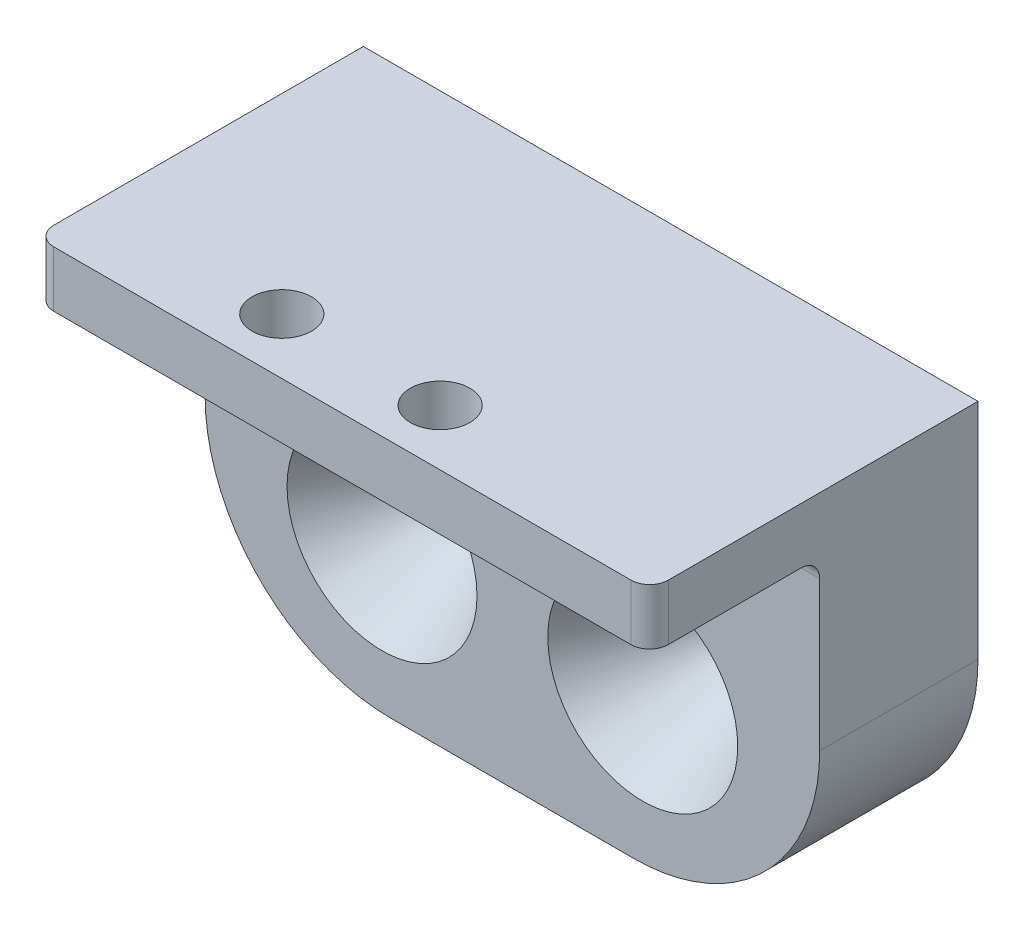
ISO-10303-21;
HEADER;
FILE_DESCRIPTION(('STEP AP214'),'2;1');
FILE_NAME('part.step','',(''),(''),'','','');
FILE_SCHEMA(('AUTOMOTIVE_DESIGN { 1 0 10303 214 1 1 1 1 }'));
ENDSEC;
DATA;
#1=APPLICATION_CONTEXT('core data for automotive mechanical design processes');
#2=APPLICATION_PROTOCOL_DEFINITION('international standard','automotive_design',2000,#1);
#3=PRODUCT_CONTEXT('',#1,'mechanical');
#4=PRODUCT('Part','Part','',(#3));
#5=PRODUCT_RELATED_PRODUCT_CATEGORY('part','',(#4));
#6=PRODUCT_DEFINITION_FORMATION('','',#4);
#7=PRODUCT_DEFINITION_CONTEXT('part definition',#1,'design');
#8=PRODUCT_DEFINITION('design','',#6,#7);
#9=PRODUCT_DEFINITION_SHAPE('','',#8);
#10=(LENGTH_UNIT() NAMED_UNIT(*) SI_UNIT(.MILLI.,.METRE.));
#11=(NAMED_UNIT(*) PLANE_ANGLE_UNIT() SI_UNIT($,.RADIAN.));
#12=(NAMED_UNIT(*) SI_UNIT($,.STERADIAN.) SOLID_ANGLE_UNIT());
#13=UNCERTAINTY_MEASURE_WITH_UNIT(LENGTH_MEASURE(1.E-05),#10,'distance_accuracy_value','');
#14=(GEOMETRIC_REPRESENTATION_CONTEXT(3) GLOBAL_UNCERTAINTY_ASSIGNED_CONTEXT((#13)) GLOBAL_UNIT_ASSIGNED_CONTEXT((#10,
#11,#12)) REPRESENTATION_CONTEXT('',''));
#15=CARTESIAN_POINT('',(0.,0.,0.));
#16=DIRECTION('',(0.,0.,1.));
#17=DIRECTION('',(1.,0.,0.));
#18=AXIS2_PLACEMENT_3D('',#15,#16,#17);
#19=CARTESIAN_POINT('',(16.5,-8.,-8.5));
#20=DIRECTION('',(1.,0.,0.));
#21=DIRECTION('',(0.,0.,-1.));
#22=AXIS2_PLACEMENT_3D('',#19,#20,#21);
#23=PLANE('',#22);
#24=DIRECTION('',(0.,0.,1.));
#25=VECTOR('',#24,1.);
#26=CARTESIAN_POINT('',(16.5,14.,0.));
#27=LINE('',#26,#25);
#28=CARTESIAN_POINT('',(16.5,14.,-8.5));
#29=VERTEX_POINT('',#28);
#30=CARTESIAN_POINT('',(16.5,14.,8.13));
#31=VERTEX_POINT('',#30);
#32=EDGE_CURVE('E126',#29,#31,#27,.T.);
#33=ORIENTED_EDGE('',*,*,#32,.T.);
#34=DIRECTION('',(0.,-1.,0.));
#35=VECTOR('',#34,1.);
#36=CARTESIAN_POINT('',(16.5,11.,8.13));
#37=LINE('',#36,#35);
#38=CARTESIAN_POINT('',(16.5,11.,8.13));
#39=VERTEX_POINT('',#38);
#40=EDGE_CURVE('E207',#31,#39,#37,.T.);
#41=ORIENTED_EDGE('',*,*,#40,.T.);
#42=DIRECTION('',(0.,0.,1.));
#43=VECTOR('',#42,1.);
#44=CARTESIAN_POINT('',(16.5,11.,9.13));
#45=LINE('',#44,#43);
#46=CARTESIAN_POINT('',(16.5,11.,0.999999999999999));
#47=VERTEX_POINT('',#46);
#48=EDGE_CURVE('E227',#47,#39,#45,.T.);
#49=ORIENTED_EDGE('',*,*,#48,.F.);
#50=CARTESIAN_POINT('',(16.5,10.,0.999999999999999));
#51=DIRECTION('',(1.,0.,0.));
#52=DIRECTION('',(0.,0.,-1.));
#53=AXIS2_PLACEMENT_3D('',#50,#51,#52);
#54=CIRCLE('',#53,1.);
#55=CARTESIAN_POINT('',(16.5,10.,0.));
#56=VERTEX_POINT('',#55);
#57=EDGE_CURVE('E49',#47,#56,#54,.F.);
#58=ORIENTED_EDGE('',*,*,#57,.T.);
#59=DIRECTION('',(0.,1.,0.));
#60=VECTOR('',#59,1.);
#61=CARTESIAN_POINT('',(16.5,-8.,0.));
#62=LINE('',#61,#60);
#63=CARTESIAN_POINT('',(16.5,2.,0.));
#64=VERTEX_POINT('',#63);
#65=EDGE_CURVE('E162',#64,#56,#62,.T.);
#66=ORIENTED_EDGE('',*,*,#65,.F.);
#67=DIRECTION('',(0.,0.,1.));
#68=VECTOR('',#67,1.);
#69=CARTESIAN_POINT('',(16.5,2.,-8.5));
#70=LINE('',#69,#68);
#71=CARTESIAN_POINT('',(16.5,2.,-8.5));
#72=VERTEX_POINT('',#71);
#73=EDGE_CURVE('E129',#64,#72,#70,.F.);
#74=ORIENTED_EDGE('',*,*,#73,.T.);
#75=DIRECTION('',(0.,1.,0.));
#76=VECTOR('',#75,1.);
#77=CARTESIAN_POINT('',(16.5,-8.,-8.5));
#78=LINE('',#77,#76);
#79=EDGE_CURVE('E123',#72,#29,#78,.T.);
#80=ORIENTED_EDGE('',*,*,#79,.T.);
#81=EDGE_LOOP('',(#33,#41,#49,#58,#66,#74,#80));
#82=FACE_BOUND('',#81,.T.);
#83=ADVANCED_FACE('F41',(#82),#23,.T.);
#84=CARTESIAN_POINT('',(-16.5,-8.,-8.5));
#85=DIRECTION('',(0.,-1.,0.));
#86=DIRECTION('',(0.,0.,-1.));
#87=AXIS2_PLACEMENT_3D('',#84,#85,#86);
#88=PLANE('',#87);
#89=DIRECTION('',(1.,0.,0.));
#90=VECTOR('',#89,1.);
#91=CARTESIAN_POINT('',(-16.5,-8.,-8.5));
#92=LINE('',#91,#90);
#93=CARTESIAN_POINT('',(-6.49999999999999,-8.,-8.5));
#94=VERTEX_POINT('',#93);
#95=CARTESIAN_POINT('',(6.50000000000001,-8.,-8.5));
#96=VERTEX_POINT('',#95);
#97=EDGE_CURVE('E165',#94,#96,#92,.T.);
#98=ORIENTED_EDGE('',*,*,#97,.T.);
#99=DIRECTION('',(0.,0.,1.));
#100=VECTOR('',#99,1.);
#101=CARTESIAN_POINT('',(6.50000000000001,-8.,-8.5));
#102=LINE('',#101,#100);
#103=CARTESIAN_POINT('',(6.50000000000001,-8.,0.));
#104=VERTEX_POINT('',#103);
#105=EDGE_CURVE('E175',#96,#104,#102,.T.);
#106=ORIENTED_EDGE('',*,*,#105,.T.);
#107=DIRECTION('',(1.,0.,0.));
#108=VECTOR('',#107,1.);
#109=CARTESIAN_POINT('',(-16.5,-8.,0.));
#110=LINE('',#109,#108);
#111=CARTESIAN_POINT('',(-6.49999999999999,-8.,0.));
#112=VERTEX_POINT('',#111);
#113=EDGE_CURVE('E133',#112,#104,#110,.T.);
#114=ORIENTED_EDGE('',*,*,#113,.F.);
#115=DIRECTION('',(0.,0.,1.));
#116=VECTOR('',#115,1.);
#117=CARTESIAN_POINT('',(-6.49999999999999,-8.,-8.5));
#118=LINE('',#117,#116);
#119=EDGE_CURVE('E168',#112,#94,#118,.F.);
#120=ORIENTED_EDGE('',*,*,#119,.T.);
#121=EDGE_LOOP('',(#98,#106,#114,#120));
#122=FACE_BOUND('',#121,.T.);
#123=ADVANCED_FACE('F266',(#122),#88,.T.);
#124=CARTESIAN_POINT('',(-16.5,-8.,-8.5));
#125=DIRECTION('',(-1.,0.,0.));
#126=DIRECTION('',(0.,0.,1.));
#127=AXIS2_PLACEMENT_3D('',#124,#125,#126);
#128=PLANE('',#127);
#129=DIRECTION('',(0.,0.,1.));
#130=VECTOR('',#129,1.);
#131=CARTESIAN_POINT('',(-16.5,11.,9.13));
#132=LINE('',#131,#130);
#133=CARTESIAN_POINT('',(-16.5,11.,0.999999999999999));
#134=VERTEX_POINT('',#133);
#135=CARTESIAN_POINT('',(-16.5,11.,8.13));
#136=VERTEX_POINT('',#135);
#137=EDGE_CURVE('E228',#134,#136,#132,.T.);
#138=ORIENTED_EDGE('',*,*,#137,.T.);
#139=DIRECTION('',(0.,-1.,0.));
#140=VECTOR('',#139,1.);
#141=CARTESIAN_POINT('',(-16.5,14.,8.13));
#142=LINE('',#141,#140);
#143=CARTESIAN_POINT('',(-16.5,14.,8.13));
#144=VERTEX_POINT('',#143);
#145=EDGE_CURVE('E202',#136,#144,#142,.F.);
#146=ORIENTED_EDGE('',*,*,#145,.T.);
#147=DIRECTION('',(0.,0.,-1.));
#148=VECTOR('',#147,1.);
#149=CARTESIAN_POINT('',(-16.5,14.,0.));
#150=LINE('',#149,#148);
#151=CARTESIAN_POINT('',(-16.5,14.,-8.5));
#152=VERTEX_POINT('',#151);
#153=EDGE_CURVE('E141',#144,#152,#150,.T.);
#154=ORIENTED_EDGE('',*,*,#153,.T.);
#155=DIRECTION('',(0.,-1.,0.));
#156=VECTOR('',#155,1.);
#157=CARTESIAN_POINT('',(-16.5,-8.,-8.5));
#158=LINE('',#157,#156);
#159=CARTESIAN_POINT('',(-16.5,2.,-8.5));
#160=VERTEX_POINT('',#159);
#161=EDGE_CURVE('E132',#152,#160,#158,.T.);
#162=ORIENTED_EDGE('',*,*,#161,.T.);
#163=DIRECTION('',(0.,0.,1.));
#164=VECTOR('',#163,1.);
#165=CARTESIAN_POINT('',(-16.5,2.,-8.5));
#166=LINE('',#165,#164);
#167=CARTESIAN_POINT('',(-16.5,2.,0.));
#168=VERTEX_POINT('',#167);
#169=EDGE_CURVE('E187',#160,#168,#166,.T.);
#170=ORIENTED_EDGE('',*,*,#169,.T.);
#171=DIRECTION('',(0.,-1.,0.));
#172=VECTOR('',#171,1.);
#173=CARTESIAN_POINT('',(-16.5,-8.,0.));
#174=LINE('',#173,#172);
#175=CARTESIAN_POINT('',(-16.5,10.,0.));
#176=VERTEX_POINT('',#175);
#177=EDGE_CURVE('E170',#176,#168,#174,.T.);
#178=ORIENTED_EDGE('',*,*,#177,.F.);
#179=CARTESIAN_POINT('',(-16.5,10.,0.999999999999999));
#180=DIRECTION('',(-1.,0.,0.));
#181=DIRECTION('',(0.,0.,1.));
#182=AXIS2_PLACEMENT_3D('',#179,#180,#181);
#183=CIRCLE('',#182,1.);
#184=EDGE_CURVE('E11',#176,#134,#183,.F.);
#185=ORIENTED_EDGE('',*,*,#184,.T.);
#186=EDGE_LOOP('',(#138,#146,#154,#162,#170,#178,#185));
#187=FACE_BOUND('',#186,.T.);
#188=ADVANCED_FACE('F219',(#187),#128,.T.);
#189=CARTESIAN_POINT('',(0.,0.,-8.5));
#190=DIRECTION('',(0.,0.,-1.));
#191=DIRECTION('',(-1.,0.,0.));
#192=AXIS2_PLACEMENT_3D('',#189,#190,#191);
#193=PLANE('',#192);
#194=ORIENTED_EDGE('',*,*,#79,.F.);
#195=CARTESIAN_POINT('',(6.50000000000001,2.,-8.5));
#196=DIRECTION('',(0.,0.,-1.));
#197=DIRECTION('',(-1.,0.,0.));
#198=AXIS2_PLACEMENT_3D('',#195,#196,#197);
#199=CIRCLE('',#198,10.);
#200=EDGE_CURVE('E185',#72,#96,#199,.T.);
#201=ORIENTED_EDGE('',*,*,#200,.T.);
#202=ORIENTED_EDGE('',*,*,#97,.F.);
#203=CARTESIAN_POINT('',(-6.49999999999999,2.,-8.5));
#204=DIRECTION('',(0.,0.,-1.));
#205=DIRECTION('',(-1.,0.,0.));
#206=AXIS2_PLACEMENT_3D('',#203,#204,#205);
#207=CIRCLE('',#206,10.);
#208=EDGE_CURVE('E183',#94,#160,#207,.T.);
#209=ORIENTED_EDGE('',*,*,#208,.T.);
#210=ORIENTED_EDGE('',*,*,#161,.F.);
#211=DIRECTION('',(1.,0.,0.));
#212=VECTOR('',#211,1.);
#213=CARTESIAN_POINT('',(-26.9043260233424,14.,-8.5));
#214=LINE('',#213,#212);
#215=EDGE_CURVE('E137',#152,#29,#214,.T.);
#216=ORIENTED_EDGE('',*,*,#215,.T.);
#217=EDGE_LOOP('',(#194,#201,#202,#209,#210,#216));
#218=FACE_BOUND('',#217,.T.);
#219=ADVANCED_FACE('F138',(#218),#193,.T.);
#220=CARTESIAN_POINT('',(0.,0.,0.));
#221=DIRECTION('',(0.,0.,-1.));
#222=DIRECTION('',(-1.,0.,0.));
#223=AXIS2_PLACEMENT_3D('',#220,#221,#222);
#224=PLANE('',#223);
#225=CARTESIAN_POINT('',(7.,0.,0.));
#226=DIRECTION('',(0.,0.,-1.));
#227=DIRECTION('',(-1.,0.,0.));
#228=AXIS2_PLACEMENT_3D('',#225,#226,#227);
#229=CIRCLE('',#228,5.1);
#230=CARTESIAN_POINT('',(1.9,0.,0.));
#231=VERTEX_POINT('',#230);
#232=EDGE_CURVE('E154',#231,#231,#229,.T.);
#233=ORIENTED_EDGE('',*,*,#232,.T.);
#234=EDGE_LOOP('',(#233));
#235=FACE_BOUND('',#234,.T.);
#236=CARTESIAN_POINT('',(-7.,0.,0.));
#237=DIRECTION('',(0.,0.,1.));
#238=DIRECTION('',(1.,0.,0.));
#239=AXIS2_PLACEMENT_3D('',#236,#237,#238);
#240=CIRCLE('',#239,5.1);
#241=CARTESIAN_POINT('',(-1.9,0.,0.));
#242=VERTEX_POINT('',#241);
#243=EDGE_CURVE('E160',#242,#242,#240,.T.);
#244=ORIENTED_EDGE('',*,*,#243,.F.);
#245=EDGE_LOOP('',(#244));
#246=FACE_BOUND('',#245,.T.);
#247=ORIENTED_EDGE('',*,*,#65,.T.);
#248=DIRECTION('',(1.,0.,0.));
#249=VECTOR('',#248,1.);
#250=CARTESIAN_POINT('',(-16.5,10.,0.));
#251=LINE('',#250,#249);
#252=EDGE_CURVE('E209',#56,#176,#251,.F.);
#253=ORIENTED_EDGE('',*,*,#252,.T.);
#254=ORIENTED_EDGE('',*,*,#177,.T.);
#255=CARTESIAN_POINT('',(-6.49999999999999,2.,0.));
#256=DIRECTION('',(0.,0.,-1.));
#257=DIRECTION('',(-1.,0.,0.));
#258=AXIS2_PLACEMENT_3D('',#255,#256,#257);
#259=CIRCLE('',#258,10.);
#260=EDGE_CURVE('E178',#168,#112,#259,.F.);
#261=ORIENTED_EDGE('',*,*,#260,.T.);
#262=ORIENTED_EDGE('',*,*,#113,.T.);
#263=CARTESIAN_POINT('',(6.50000000000001,2.,0.));
#264=DIRECTION('',(0.,0.,-1.));
#265=DIRECTION('',(-1.,0.,0.));
#266=AXIS2_PLACEMENT_3D('',#263,#264,#265);
#267=CIRCLE('',#266,10.);
#268=EDGE_CURVE('E180',#104,#64,#267,.F.);
#269=ORIENTED_EDGE('',*,*,#268,.T.);
#270=EDGE_LOOP('',(#247,#253,#254,#261,#262,#269));
#271=FACE_BOUND('',#270,.T.);
#272=ADVANCED_FACE('F213',(#235,#246,#271),#224,.F.);
#273=CARTESIAN_POINT('',(-7.,0.,-6.1));
#274=DIRECTION('',(0.,0.,1.));
#275=DIRECTION('',(1.,0.,0.));
#276=AXIS2_PLACEMENT_3D('',#273,#274,#275);
#277=CONICAL_SURFACE('',#276,1.57816335794325,0.523598775598303);
#278=CARTESIAN_POINT('',(-7.,0.,-6.1));
#279=DIRECTION('',(0.,0.,1.));
#280=DIRECTION('',(1.,0.,0.));
#281=AXIS2_PLACEMENT_3D('',#278,#279,#280);
#282=CIRCLE('',#281,1.57816335794325);
#283=CARTESIAN_POINT('',(-5.42183664205675,0.,-6.1));
#284=VERTEX_POINT('',#283);
#285=EDGE_CURVE('E157',#284,#284,#282,.T.);
#286=CARTESIAN_POINT('',(-1.9,0.,0.));
#287=CARTESIAN_POINT('',(-1.93668579835476,0.,-0.0635416666666657));
#288=CARTESIAN_POINT('',(-1.97337159670952,0.,-0.127083333333332));
#289=CARTESIAN_POINT('',(-2.04674319341903,0.,-0.254166666666666));
#290=CARTESIAN_POINT('',(-2.08342899177379,0.,-0.317708333333332));
#291=CARTESIAN_POINT('',(-2.15680058848331,0.,-0.444791666666666));
#292=CARTESIAN_POINT('',(-2.19348638683806,0.,-0.508333333333333));
#293=CARTESIAN_POINT('',(-2.26685798354758,0.,-0.635416666666666));
#294=CARTESIAN_POINT('',(-2.30354378190234,0.,-0.698958333333333));
#295=CARTESIAN_POINT('',(-2.37691537861185,0.,-0.826041666666666));
#296=CARTESIAN_POINT('',(-2.41360117696661,0.,-0.889583333333333));
#297=CARTESIAN_POINT('',(-2.48697277367613,0.,-1.01666666666667));
#298=CARTESIAN_POINT('',(-2.52365857203088,0.,-1.08020833333333));
#299=CARTESIAN_POINT('',(-2.5970301687404,0.,-1.20729166666667));
#300=CARTESIAN_POINT('',(-2.63371596709516,0.,-1.27083333333333));
#301=CARTESIAN_POINT('',(-2.70708756380467,0.,-1.39791666666667));
#302=CARTESIAN_POINT('',(-2.74377336215943,0.,-1.46145833333333));
#303=CARTESIAN_POINT('',(-2.81714495886895,0.,-1.58854166666667));
#304=CARTESIAN_POINT('',(-2.85383075722371,0.,-1.65208333333333));
#305=CARTESIAN_POINT('',(-2.92720235393322,0.,-1.77916666666667));
#306=CARTESIAN_POINT('',(-2.96388815228798,0.,-1.84270833333333));
#307=CARTESIAN_POINT('',(-3.03725974899749,0.,-1.96979166666667));
#308=CARTESIAN_POINT('',(-3.07394554735225,0.,-2.03333333333333));
#309=CARTESIAN_POINT('',(-3.14731714406177,0.,-2.16041666666667));
#310=CARTESIAN_POINT('',(-3.18400294241653,0.,-2.22395833333333));
#311=CARTESIAN_POINT('',(-3.25737453912604,0.,-2.35104166666667));
#312=CARTESIAN_POINT('',(-3.2940603374808,0.,-2.41458333333333));
#313=CARTESIAN_POINT('',(-3.36743193419032,0.,-2.54166666666667));
#314=CARTESIAN_POINT('',(-3.40411773254507,0.,-2.60520833333333));
#315=CARTESIAN_POINT('',(-3.47748932925459,0.,-2.73229166666667));
#316=CARTESIAN_POINT('',(-3.51417512760935,0.,-2.79583333333333));
#317=CARTESIAN_POINT('',(-3.58754672431886,0.,-2.92291666666667));
#318=CARTESIAN_POINT('',(-3.62423252267362,0.,-2.98645833333333));
#319=CARTESIAN_POINT('',(-3.69760411938314,0.,-3.11354166666667));
#320=CARTESIAN_POINT('',(-3.73428991773789,0.,-3.17708333333333));
#321=CARTESIAN_POINT('',(-3.80766151444741,0.,-3.30416666666667));
#322=CARTESIAN_POINT('',(-3.84434731280217,0.,-3.36770833333333));
#323=CARTESIAN_POINT('',(-3.91771890951168,0.,-3.49479166666667));
#324=CARTESIAN_POINT('',(-3.95440470786644,0.,-3.55833333333333));
#325=CARTESIAN_POINT('',(-4.02777630457596,0.,-3.68541666666667));
#326=CARTESIAN_POINT('',(-4.06446210293071,0.,-3.74895833333333));
#327=CARTESIAN_POINT('',(-4.13783369964023,0.,-3.87604166666667));
#328=CARTESIAN_POINT('',(-4.17451949799499,0.,-3.93958333333333));
#329=CARTESIAN_POINT('',(-4.2478910947045,0.,-4.06666666666667));
#330=CARTESIAN_POINT('',(-4.28457689305926,0.,-4.13020833333333));
#331=CARTESIAN_POINT('',(-4.35794848976878,0.,-4.25729166666667));
#332=CARTESIAN_POINT('',(-4.39463428812353,0.,-4.32083333333333));
#333=CARTESIAN_POINT('',(-4.46800588483305,0.,-4.44791666666667));
#334=CARTESIAN_POINT('',(-4.50469168318781,0.,-4.51145833333333));
#335=CARTESIAN_POINT('',(-4.57806327989732,0.,-4.63854166666667));
#336=CARTESIAN_POINT('',(-4.61474907825208,0.,-4.70208333333333));
#337=CARTESIAN_POINT('',(-4.6881206749616,0.,-4.82916666666667));
#338=CARTESIAN_POINT('',(-4.72480647331636,0.,-4.89270833333333));
#339=CARTESIAN_POINT('',(-4.79817807002587,0.,-5.01979166666667));
#340=CARTESIAN_POINT('',(-4.83486386838063,0.,-5.08333333333333));
#341=CARTESIAN_POINT('',(-4.90823546509014,0.,-5.21041666666667));
#342=CARTESIAN_POINT('',(-4.9449212634449,0.,-5.27395833333333));
#343=CARTESIAN_POINT('',(-5.01829286015442,0.,-5.40104166666667));
#344=CARTESIAN_POINT('',(-5.05497865850918,0.,-5.46458333333333));
#345=CARTESIAN_POINT('',(-5.12835025521869,0.,-5.59166666666667));
#346=CARTESIAN_POINT('',(-5.16503605357345,0.,-5.65520833333333));
#347=CARTESIAN_POINT('',(-5.23840765028297,0.,-5.78229166666667));
#348=CARTESIAN_POINT('',(-5.27509344863772,0.,-5.84583333333333));
#349=CARTESIAN_POINT('',(-5.34846504534724,0.,-5.97291666666667));
#350=CARTESIAN_POINT('',(-5.385150843702,0.,-6.03645833333333));
#351=CARTESIAN_POINT('',(-5.42183664205675,0.,-6.1));
#352=B_SPLINE_CURVE_WITH_KNOTS('',3,(#286,#287,#288,#289,#290,#291,#292,#293,#294,#295,#296,
#297,#298,#299,#300,#301,#302,#303,#304,#305,#306,#307,#308,#309,#310,#311,#312,#313,#314,#315,
#316,#317,#318,#319,#320,#321,#322,#323,#324,#325,#326,#327,#328,#329,#330,#331,#332,#333,#334,
#335,#336,#337,#338,#339,#340,#341,#342,#343,#344,#345,#346,#347,#348,#349,#350,#351),
.UNSPECIFIED.,.F.,.F.,(4,2,2,2,2,2,2,2,2,2,2,2,2,2,2,2,2,2,2,2,2,2,2,2,2,2,2,2,2,2,2,2,4),(0.,
0.220114790128545,0.44022958025709,0.660344370385636,0.880459160514182,1.10057395064273,
1.32068874077127,1.54080353089982,1.76091832102836,1.98103311115691,2.20114790128545,
2.421262691414,2.64137748154254,2.86149227167109,3.08160706179964,3.30172185192818,
3.52183664205673,3.74195143218527,3.96206622231382,4.18218101244236,4.40229580257091,
4.62241059269945,4.842525382828,5.06264017295654,5.28275496308509,5.50286975321363,
5.72298454334218,5.94309933347072,6.16321412359927,6.38332891372782,6.60344370385636,
6.82355849398491,7.04367328411345),.UNSPECIFIED.);
#353=EDGE_CURVE('BSEAM318',#242,#284,#352,.T.);
#354=ORIENTED_EDGE('',*,*,#243,.T.);
#355=ORIENTED_EDGE('',*,*,#285,.F.);
#356=ORIENTED_EDGE('',*,*,#353,.T.);
#357=ORIENTED_EDGE('',*,*,#353,.F.);
#358=EDGE_LOOP('',(#354,#356,#355,#357));
#359=FACE_BOUND('',#358,.T.);
#360=ADVANCED_FACE('F318',(#359),#277,.F.);
#361=CARTESIAN_POINT('',(-8.57816335794325,0.,-6.1));
#362=DIRECTION('',(0.,0.,1.));
#363=DIRECTION('',(1.,0.,0.));
#364=AXIS2_PLACEMENT_3D('',#361,#362,#363);
#365=PLANE('',#364);
#366=ORIENTED_EDGE('',*,*,#285,.T.);
#367=EDGE_LOOP('',(#366));
#368=FACE_BOUND('',#367,.T.);
#369=ADVANCED_FACE('F314',(#368),#365,.T.);
#370=CARTESIAN_POINT('',(7.,0.,-6.1));
#371=DIRECTION('',(0.,0.,1.));
#372=DIRECTION('',(-1.,0.,0.));
#373=AXIS2_PLACEMENT_3D('',#370,#371,#372);
#374=CONICAL_SURFACE('',#373,1.57816335794325,0.523598775598303);
#375=CARTESIAN_POINT('',(7.,0.,-6.1));
#376=DIRECTION('',(0.,0.,-1.));
#377=DIRECTION('',(-1.,0.,0.));
#378=AXIS2_PLACEMENT_3D('',#375,#376,#377);
#379=CIRCLE('',#378,1.57816335794325);
#380=CARTESIAN_POINT('',(5.42183664205675,0.,-6.1));
#381=VERTEX_POINT('',#380);
#382=EDGE_CURVE('E151',#381,#381,#379,.T.);
#383=CARTESIAN_POINT('',(1.9,0.,0.));
#384=CARTESIAN_POINT('',(1.93668579835476,0.,-0.0635416666666658));
#385=CARTESIAN_POINT('',(1.97337159670952,0.,-0.127083333333332));
#386=CARTESIAN_POINT('',(2.04674319341903,0.,-0.254166666666666));
#387=CARTESIAN_POINT('',(2.08342899177379,0.,-0.317708333333332));
#388=CARTESIAN_POINT('',(2.15680058848331,0.,-0.444791666666665));
#389=CARTESIAN_POINT('',(2.19348638683806,0.,-0.508333333333332));
#390=CARTESIAN_POINT('',(2.26685798354758,0.,-0.635416666666666));
#391=CARTESIAN_POINT('',(2.30354378190234,0.,-0.698958333333332));
#392=CARTESIAN_POINT('',(2.37691537861185,0.,-0.826041666666666));
#393=CARTESIAN_POINT('',(2.41360117696661,0.,-0.889583333333333));
#394=CARTESIAN_POINT('',(2.48697277367613,0.,-1.01666666666667));
#395=CARTESIAN_POINT('',(2.52365857203088,0.,-1.08020833333333));
#396=CARTESIAN_POINT('',(2.5970301687404,0.,-1.20729166666667));
#397=CARTESIAN_POINT('',(2.63371596709516,0.,-1.27083333333333));
#398=CARTESIAN_POINT('',(2.70708756380467,0.,-1.39791666666667));
#399=CARTESIAN_POINT('',(2.74377336215943,0.,-1.46145833333333));
#400=CARTESIAN_POINT('',(2.81714495886895,0.,-1.58854166666667));
#401=CARTESIAN_POINT('',(2.85383075722371,0.,-1.65208333333333));
#402=CARTESIAN_POINT('',(2.92720235393322,0.,-1.77916666666667));
#403=CARTESIAN_POINT('',(2.96388815228798,0.,-1.84270833333333));
#404=CARTESIAN_POINT('',(3.03725974899749,0.,-1.96979166666667));
#405=CARTESIAN_POINT('',(3.07394554735225,0.,-2.03333333333333));
#406=CARTESIAN_POINT('',(3.14731714406177,0.,-2.16041666666667));
#407=CARTESIAN_POINT('',(3.18400294241653,0.,-2.22395833333333));
#408=CARTESIAN_POINT('',(3.25737453912604,0.,-2.35104166666667));
#409=CARTESIAN_POINT('',(3.2940603374808,0.,-2.41458333333333));
#410=CARTESIAN_POINT('',(3.36743193419032,0.,-2.54166666666667));
#411=CARTESIAN_POINT('',(3.40411773254507,0.,-2.60520833333333));
#412=CARTESIAN_POINT('',(3.47748932925459,0.,-2.73229166666667));
#413=CARTESIAN_POINT('',(3.51417512760935,0.,-2.79583333333333));
#414=CARTESIAN_POINT('',(3.58754672431886,0.,-2.92291666666667));
#415=CARTESIAN_POINT('',(3.62423252267362,0.,-2.98645833333333));
#416=CARTESIAN_POINT('',(3.69760411938314,0.,-3.11354166666667));
#417=CARTESIAN_POINT('',(3.73428991773789,0.,-3.17708333333333));
#418=CARTESIAN_POINT('',(3.80766151444741,0.,-3.30416666666667));
#419=CARTESIAN_POINT('',(3.84434731280217,0.,-3.36770833333333));
#420=CARTESIAN_POINT('',(3.91771890951168,0.,-3.49479166666667));
#421=CARTESIAN_POINT('',(3.95440470786644,0.,-3.55833333333333));
#422=CARTESIAN_POINT('',(4.02777630457596,0.,-3.68541666666667));
#423=CARTESIAN_POINT('',(4.06446210293071,0.,-3.74895833333333));
#424=CARTESIAN_POINT('',(4.13783369964023,0.,-3.87604166666667));
#425=CARTESIAN_POINT('',(4.17451949799499,0.,-3.93958333333333));
#426=CARTESIAN_POINT('',(4.2478910947045,0.,-4.06666666666667));
#427=CARTESIAN_POINT('',(4.28457689305926,0.,-4.13020833333333));
#428=CARTESIAN_POINT('',(4.35794848976878,0.,-4.25729166666667));
#429=CARTESIAN_POINT('',(4.39463428812353,0.,-4.32083333333333));
#430=CARTESIAN_POINT('',(4.46800588483305,0.,-4.44791666666667));
#431=CARTESIAN_POINT('',(4.50469168318781,0.,-4.51145833333333));
#432=CARTESIAN_POINT('',(4.57806327989732,0.,-4.63854166666667));
#433=CARTESIAN_POINT('',(4.61474907825208,0.,-4.70208333333333));
#434=CARTESIAN_POINT('',(4.6881206749616,0.,-4.82916666666667));
#435=CARTESIAN_POINT('',(4.72480647331636,0.,-4.89270833333333));
#436=CARTESIAN_POINT('',(4.79817807002587,0.,-5.01979166666667));
#437=CARTESIAN_POINT('',(4.83486386838063,0.,-5.08333333333333));
#438=CARTESIAN_POINT('',(4.90823546509014,0.,-5.21041666666667));
#439=CARTESIAN_POINT('',(4.9449212634449,0.,-5.27395833333333));
#440=CARTESIAN_POINT('',(5.01829286015442,0.,-5.40104166666667));
#441=CARTESIAN_POINT('',(5.05497865850918,0.,-5.46458333333333));
#442=CARTESIAN_POINT('',(5.12835025521869,0.,-5.59166666666667));
#443=CARTESIAN_POINT('',(5.16503605357345,0.,-5.65520833333333));
#444=CARTESIAN_POINT('',(5.23840765028297,0.,-5.78229166666667));
#445=CARTESIAN_POINT('',(5.27509344863772,0.,-5.84583333333333));
#446=CARTESIAN_POINT('',(5.34846504534724,0.,-5.97291666666667));
#447=CARTESIAN_POINT('',(5.385150843702,0.,-6.03645833333333));
#448=CARTESIAN_POINT('',(5.42183664205675,0.,-6.1));
#449=B_SPLINE_CURVE_WITH_KNOTS('',3,(#383,#384,#385,#386,#387,#388,#389,#390,#391,#392,#393,
#394,#395,#396,#397,#398,#399,#400,#401,#402,#403,#404,#405,#406,#407,#408,#409,#410,#411,#412,
#413,#414,#415,#416,#417,#418,#419,#420,#421,#422,#423,#424,#425,#426,#427,#428,#429,#430,#431,
#432,#433,#434,#435,#436,#437,#438,#439,#440,#441,#442,#443,#444,#445,#446,#447,#448),
.UNSPECIFIED.,.F.,.F.,(4,2,2,2,2,2,2,2,2,2,2,2,2,2,2,2,2,2,2,2,2,2,2,2,2,2,2,2,2,2,2,2,4),(0.,
0.220114790128545,0.44022958025709,0.660344370385635,0.880459160514182,1.10057395064273,
1.32068874077127,1.54080353089982,1.76091832102836,1.98103311115691,2.20114790128545,
2.421262691414,2.64137748154254,2.86149227167109,3.08160706179963,3.30172185192818,
3.52183664205673,3.74195143218527,3.96206622231382,4.18218101244236,4.40229580257091,
4.62241059269945,4.842525382828,5.06264017295654,5.28275496308509,5.50286975321363,
5.72298454334218,5.94309933347072,6.16321412359927,6.38332891372781,6.60344370385636,
6.8235584939849,7.04367328411345),.UNSPECIFIED.);
#450=EDGE_CURVE('BSEAM310',#231,#381,#449,.T.);
#451=ORIENTED_EDGE('',*,*,#232,.F.);
#452=ORIENTED_EDGE('',*,*,#382,.T.);
#453=ORIENTED_EDGE('',*,*,#450,.T.);
#454=ORIENTED_EDGE('',*,*,#450,.F.);
#455=EDGE_LOOP('',(#451,#453,#452,#454));
#456=FACE_BOUND('',#455,.T.);
#457=ADVANCED_FACE('F310',(#456),#374,.F.);
#458=CARTESIAN_POINT('',(8.57816335794325,0.,-6.1));
#459=DIRECTION('',(0.,0.,1.));
#460=DIRECTION('',(-1.,0.,0.));
#461=AXIS2_PLACEMENT_3D('',#458,#459,#460);
#462=PLANE('',#461);
#463=ORIENTED_EDGE('',*,*,#382,.F.);
#464=EDGE_LOOP('',(#463));
#465=FACE_BOUND('',#464,.T.);
#466=ADVANCED_FACE('F279',(#465),#462,.T.);
#467=CARTESIAN_POINT('',(6.50000000000001,2.,-8.5));
#468=DIRECTION('',(0.,0.,1.));
#469=DIRECTION('',(1.,0.,0.));
#470=AXIS2_PLACEMENT_3D('',#467,#468,#469);
#471=CYLINDRICAL_SURFACE('',#470,10.);
#472=ORIENTED_EDGE('',*,*,#200,.F.);
#473=ORIENTED_EDGE('',*,*,#73,.F.);
#474=ORIENTED_EDGE('',*,*,#268,.F.);
#475=ORIENTED_EDGE('',*,*,#105,.F.);
#476=EDGE_LOOP('',(#472,#473,#474,#475));
#477=FACE_BOUND('',#476,.T.);
#478=ADVANCED_FACE('F276',(#477),#471,.T.);
#479=CARTESIAN_POINT('',(-6.49999999999999,2.,-8.5));
#480=DIRECTION('',(0.,0.,1.));
#481=DIRECTION('',(1.,0.,0.));
#482=AXIS2_PLACEMENT_3D('',#479,#480,#481);
#483=CYLINDRICAL_SURFACE('',#482,10.);
#484=ORIENTED_EDGE('',*,*,#208,.F.);
#485=ORIENTED_EDGE('',*,*,#119,.F.);
#486=ORIENTED_EDGE('',*,*,#260,.F.);
#487=ORIENTED_EDGE('',*,*,#169,.F.);
#488=EDGE_LOOP('',(#484,#485,#486,#487));
#489=FACE_BOUND('',#488,.T.);
#490=ADVANCED_FACE('F247',(#489),#483,.T.);
#491=CARTESIAN_POINT('',(-26.9043260233424,14.,0.));
#492=DIRECTION('',(0.,1.,0.));
#493=DIRECTION('',(0.,0.,1.));
#494=AXIS2_PLACEMENT_3D('',#491,#492,#493);
#495=PLANE('',#494);
#496=ORIENTED_EDGE('',*,*,#153,.F.);
#497=CARTESIAN_POINT('',(-15.5,14.,8.13));
#498=DIRECTION('',(0.,1.,0.));
#499=DIRECTION('',(0.,0.,1.));
#500=AXIS2_PLACEMENT_3D('',#497,#498,#499);
#501=CIRCLE('',#500,1.);
#502=CARTESIAN_POINT('',(-15.5,14.,9.13));
#503=VERTEX_POINT('',#502);
#504=EDGE_CURVE('E205',#144,#503,#501,.T.);
#505=ORIENTED_EDGE('',*,*,#504,.T.);
#506=DIRECTION('',(1.,0.,0.));
#507=VECTOR('',#506,1.);
#508=CARTESIAN_POINT('',(-16.5,14.,9.13));
#509=LINE('',#508,#507);
#510=CARTESIAN_POINT('',(15.5,14.,9.13));
#511=VERTEX_POINT('',#510);
#512=EDGE_CURVE('E145',#503,#511,#509,.T.);
#513=ORIENTED_EDGE('',*,*,#512,.T.);
#514=CARTESIAN_POINT('',(15.5,14.,8.13));
#515=DIRECTION('',(0.,1.,0.));
#516=DIRECTION('',(0.,0.,1.));
#517=AXIS2_PLACEMENT_3D('',#514,#515,#516);
#518=CIRCLE('',#517,1.);
#519=EDGE_CURVE('E63',#511,#31,#518,.T.);
#520=ORIENTED_EDGE('',*,*,#519,.T.);
#521=ORIENTED_EDGE('',*,*,#32,.F.);
#522=ORIENTED_EDGE('',*,*,#215,.F.);
#523=EDGE_LOOP('',(#496,#505,#513,#520,#521,#522));
#524=FACE_BOUND('',#523,.T.);
#525=CARTESIAN_POINT('',(-6.24999999999999,14.,6.13));
#526=DIRECTION('',(0.,1.,0.));
#527=DIRECTION('',(0.,0.,1.));
#528=AXIS2_PLACEMENT_3D('',#525,#526,#527);
#529=CIRCLE('',#528,1.6);
#530=CARTESIAN_POINT('',(-6.24999999999999,14.,7.73));
#531=VERTEX_POINT('',#530);
#532=EDGE_CURVE('E147',#531,#531,#529,.T.);
#533=ORIENTED_EDGE('',*,*,#532,.F.);
#534=EDGE_LOOP('',(#533));
#535=FACE_BOUND('',#534,.T.);
#536=CARTESIAN_POINT('',(2.25000000000001,14.,6.13));
#537=DIRECTION('',(0.,1.,0.));
#538=DIRECTION('',(0.,0.,1.));
#539=AXIS2_PLACEMENT_3D('',#536,#537,#538);
#540=CIRCLE('',#539,1.6);
#541=CARTESIAN_POINT('',(2.25000000000001,14.,7.73));
#542=VERTEX_POINT('',#541);
#543=EDGE_CURVE('E232',#542,#542,#540,.T.);
#544=ORIENTED_EDGE('',*,*,#543,.F.);
#545=EDGE_LOOP('',(#544));
#546=FACE_BOUND('',#545,.T.);
#547=ADVANCED_FACE('F143',(#524,#535,#546),#495,.T.);
#548=CARTESIAN_POINT('',(-16.5,14.,9.13));
#549=DIRECTION('',(0.,0.,-1.));
#550=DIRECTION('',(-1.,0.,0.));
#551=AXIS2_PLACEMENT_3D('',#548,#549,#550);
#552=PLANE('',#551);
#553=ORIENTED_EDGE('',*,*,#512,.F.);
#554=DIRECTION('',(0.,-1.,0.));
#555=VECTOR('',#554,1.);
#556=CARTESIAN_POINT('',(-15.5,11.,9.13));
#557=LINE('',#556,#555);
#558=CARTESIAN_POINT('',(-15.5,11.,9.13));
#559=VERTEX_POINT('',#558);
#560=EDGE_CURVE('E192',#503,#559,#557,.T.);
#561=ORIENTED_EDGE('',*,*,#560,.T.);
#562=DIRECTION('',(1.,0.,0.));
#563=VECTOR('',#562,1.);
#564=CARTESIAN_POINT('',(-16.501,11.,9.13));
#565=LINE('',#564,#563);
#566=CARTESIAN_POINT('',(15.5,11.,9.13));
#567=VERTEX_POINT('',#566);
#568=EDGE_CURVE('E229',#559,#567,#565,.T.);
#569=ORIENTED_EDGE('',*,*,#568,.T.);
#570=DIRECTION('',(0.,-1.,0.));
#571=VECTOR('',#570,1.);
#572=CARTESIAN_POINT('',(15.5,14.,9.13));
#573=LINE('',#572,#571);
#574=EDGE_CURVE('E190',#567,#511,#573,.F.);
#575=ORIENTED_EDGE('',*,*,#574,.T.);
#576=EDGE_LOOP('',(#553,#561,#569,#575));
#577=FACE_BOUND('',#576,.T.);
#578=ADVANCED_FACE('F246',(#577),#552,.F.);
#579=CARTESIAN_POINT('',(-6.24999999999999,14.,6.13));
#580=DIRECTION('',(0.,-1.,0.));
#581=DIRECTION('',(0.,0.,-1.));
#582=AXIS2_PLACEMENT_3D('',#579,#580,#581);
#583=CYLINDRICAL_SURFACE('',#582,1.6);
#584=CARTESIAN_POINT('',(-6.24999999999999,11.,6.13));
#585=DIRECTION('',(0.,1.,0.));
#586=DIRECTION('',(0.,0.,1.));
#587=AXIS2_PLACEMENT_3D('',#584,#585,#586);
#588=CIRCLE('',#587,1.6);
#589=CARTESIAN_POINT('',(-6.24999999999999,11.,7.73));
#590=VERTEX_POINT('',#589);
#591=EDGE_CURVE('E234',#590,#590,#588,.F.);
#592=ORIENTED_EDGE('',*,*,#591,.T.);
#593=EDGE_LOOP('',(#592));
#594=FACE_BOUND('',#593,.T.);
#595=ORIENTED_EDGE('',*,*,#532,.T.);
#596=EDGE_LOOP('',(#595));
#597=FACE_BOUND('',#596,.T.);
#598=ADVANCED_FACE('F243',(#594,#597),#583,.F.);
#599=CARTESIAN_POINT('',(2.25000000000001,14.,6.13));
#600=DIRECTION('',(0.,-1.,0.));
#601=DIRECTION('',(0.,0.,-1.));
#602=AXIS2_PLACEMENT_3D('',#599,#600,#601);
#603=CYLINDRICAL_SURFACE('',#602,1.6);
#604=CARTESIAN_POINT('',(2.25000000000001,11.,6.13));
#605=DIRECTION('',(0.,1.,0.));
#606=DIRECTION('',(0.,0.,1.));
#607=AXIS2_PLACEMENT_3D('',#604,#605,#606);
#608=CIRCLE('',#607,1.6);
#609=CARTESIAN_POINT('',(2.25000000000001,11.,7.73));
#610=VERTEX_POINT('',#609);
#611=EDGE_CURVE('E465',#610,#610,#608,.F.);
#612=ORIENTED_EDGE('',*,*,#611,.T.);
#613=EDGE_LOOP('',(#612));
#614=FACE_BOUND('',#613,.T.);
#615=ORIENTED_EDGE('',*,*,#543,.T.);
#616=EDGE_LOOP('',(#615));
#617=FACE_BOUND('',#616,.T.);
#618=ADVANCED_FACE('F251',(#614,#617),#603,.F.);
#619=CARTESIAN_POINT('',(-16.501,11.,9.13));
#620=DIRECTION('',(0.,1.,0.));
#621=DIRECTION('',(0.,0.,1.));
#622=AXIS2_PLACEMENT_3D('',#619,#620,#621);
#623=PLANE('',#622);
#624=ORIENTED_EDGE('',*,*,#591,.F.);
#625=EDGE_LOOP('',(#624));
#626=FACE_BOUND('',#625,.T.);
#627=ORIENTED_EDGE('',*,*,#611,.F.);
#628=EDGE_LOOP('',(#627));
#629=FACE_BOUND('',#628,.T.);
#630=ORIENTED_EDGE('',*,*,#568,.F.);
#631=CARTESIAN_POINT('',(-15.5,11.,8.13));
#632=DIRECTION('',(0.,1.,0.));
#633=DIRECTION('',(0.,0.,1.));
#634=AXIS2_PLACEMENT_3D('',#631,#632,#633);
#635=CIRCLE('',#634,1.);
#636=EDGE_CURVE('E200',#559,#136,#635,.F.);
#637=ORIENTED_EDGE('',*,*,#636,.T.);
#638=ORIENTED_EDGE('',*,*,#137,.F.);
#639=DIRECTION('',(1.,0.,0.));
#640=VECTOR('',#639,1.);
#641=CARTESIAN_POINT('',(16.5,11.,0.999999999999999));
#642=LINE('',#641,#640);
#643=EDGE_CURVE('E195',#134,#47,#642,.T.);
#644=ORIENTED_EDGE('',*,*,#643,.T.);
#645=ORIENTED_EDGE('',*,*,#48,.T.);
#646=CARTESIAN_POINT('',(15.5,11.,8.13));
#647=DIRECTION('',(0.,1.,0.));
#648=DIRECTION('',(0.,0.,1.));
#649=AXIS2_PLACEMENT_3D('',#646,#647,#648);
#650=CIRCLE('',#649,1.);
#651=EDGE_CURVE('E198',#39,#567,#650,.F.);
#652=ORIENTED_EDGE('',*,*,#651,.T.);
#653=EDGE_LOOP('',(#630,#637,#638,#644,#645,#652));
#654=FACE_BOUND('',#653,.T.);
#655=ADVANCED_FACE('F226',(#626,#629,#654),#623,.F.);
#656=CARTESIAN_POINT('',(-15.5,14.,8.13));
#657=DIRECTION('',(0.,1.,0.));
#658=DIRECTION('',(0.,0.,1.));
#659=AXIS2_PLACEMENT_3D('',#656,#657,#658);
#660=CYLINDRICAL_SURFACE('',#659,1.);
#661=ORIENTED_EDGE('',*,*,#504,.F.);
#662=ORIENTED_EDGE('',*,*,#145,.F.);
#663=ORIENTED_EDGE('',*,*,#636,.F.);
#664=ORIENTED_EDGE('',*,*,#560,.F.);
#665=EDGE_LOOP('',(#661,#662,#663,#664));
#666=FACE_BOUND('',#665,.T.);
#667=ADVANCED_FACE('F260',(#666),#660,.T.);
#668=CARTESIAN_POINT('',(15.5,-8.,8.13));
#669=DIRECTION('',(0.,1.,0.));
#670=DIRECTION('',(0.,0.,1.));
#671=AXIS2_PLACEMENT_3D('',#668,#669,#670);
#672=CYLINDRICAL_SURFACE('',#671,1.);
#673=ORIENTED_EDGE('',*,*,#519,.F.);
#674=ORIENTED_EDGE('',*,*,#574,.F.);
#675=ORIENTED_EDGE('',*,*,#651,.F.);
#676=ORIENTED_EDGE('',*,*,#40,.F.);
#677=EDGE_LOOP('',(#673,#674,#675,#676));
#678=FACE_BOUND('',#677,.T.);
#679=ADVANCED_FACE('F285',(#678),#672,.T.);
#680=CARTESIAN_POINT('',(-16.501,10.,0.999999999999999));
#681=DIRECTION('',(-1.,0.,0.));
#682=DIRECTION('',(0.,0.,1.));
#683=AXIS2_PLACEMENT_3D('',#680,#681,#682);
#684=CYLINDRICAL_SURFACE('',#683,1.);
#685=ORIENTED_EDGE('',*,*,#184,.F.);
#686=ORIENTED_EDGE('',*,*,#252,.F.);
#687=ORIENTED_EDGE('',*,*,#57,.F.);
#688=ORIENTED_EDGE('',*,*,#643,.F.);
#689=EDGE_LOOP('',(#685,#686,#687,#688));
#690=FACE_BOUND('',#689,.T.);
#691=ADVANCED_FACE('F43',(#690),#684,.F.);
#692=CLOSED_SHELL('',(#83,#123,#188,#219,#272,#360,#369,#457,#466,#478,#490,#547,#578,#598,#618,
#655,#667,#679,#691));
#693=MANIFOLD_SOLID_BREP('B2',#692);
#694=ADVANCED_BREP_SHAPE_REPRESENTATION('',(#18,#693),#14);
#695=SHAPE_DEFINITION_REPRESENTATION(#9,#694);
ENDSEC;
END-ISO-10303-21;
